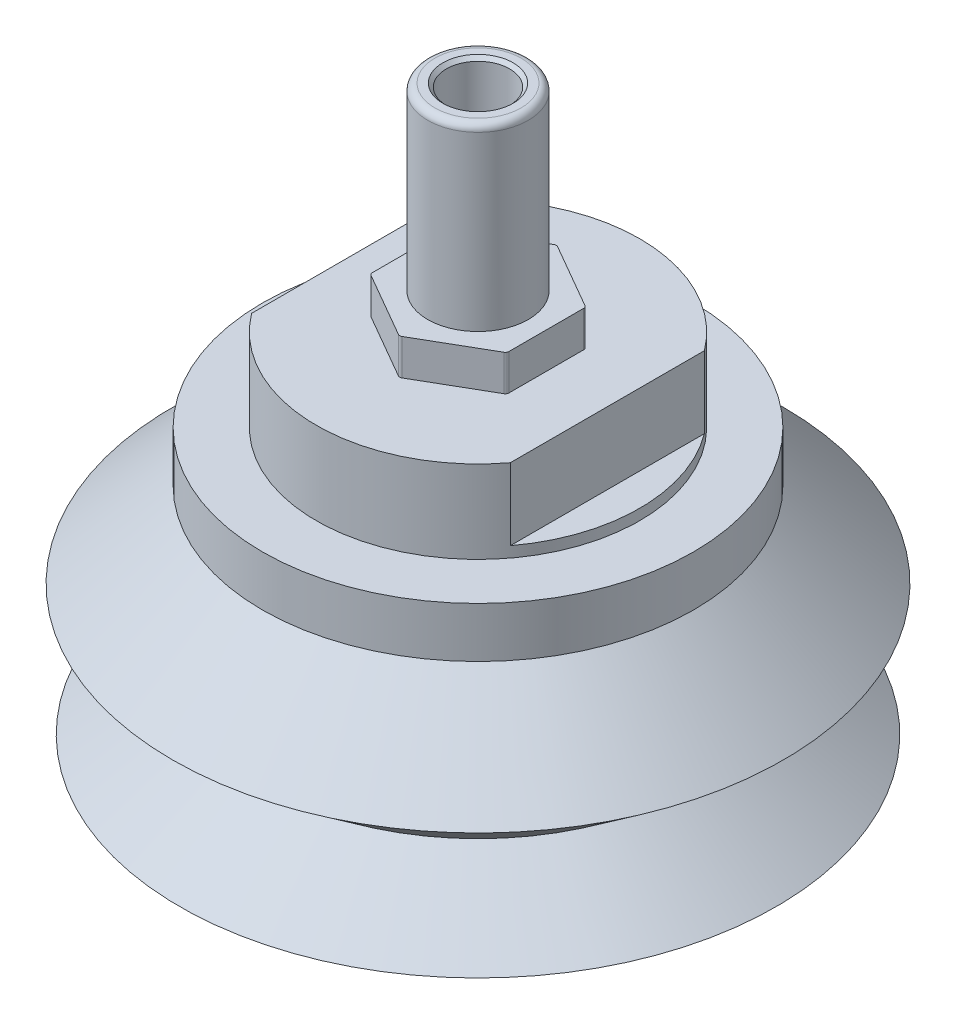
ISO-10303-21;
HEADER;
FILE_DESCRIPTION(('STEP AP214'),'2;1');
FILE_NAME('part.step','',(''),(''),'','','');
FILE_SCHEMA(('AUTOMOTIVE_DESIGN { 1 0 10303 214 1 1 1 1 }'));
ENDSEC;
DATA;
#1=APPLICATION_CONTEXT('core data for automotive mechanical design processes');
#2=APPLICATION_PROTOCOL_DEFINITION('international standard','automotive_design',2000,#1);
#3=PRODUCT_CONTEXT('',#1,'mechanical');
#4=PRODUCT('Part','Part','',(#3));
#5=PRODUCT_RELATED_PRODUCT_CATEGORY('part','',(#4));
#6=PRODUCT_DEFINITION_FORMATION('','',#4);
#7=PRODUCT_DEFINITION_CONTEXT('part definition',#1,'design');
#8=PRODUCT_DEFINITION('design','',#6,#7);
#9=PRODUCT_DEFINITION_SHAPE('','',#8);
#10=(LENGTH_UNIT() NAMED_UNIT(*) SI_UNIT(.MILLI.,.METRE.));
#11=(NAMED_UNIT(*) PLANE_ANGLE_UNIT() SI_UNIT($,.RADIAN.));
#12=(NAMED_UNIT(*) SI_UNIT($,.STERADIAN.) SOLID_ANGLE_UNIT());
#13=UNCERTAINTY_MEASURE_WITH_UNIT(LENGTH_MEASURE(1.E-05),#10,'distance_accuracy_value','');
#14=(GEOMETRIC_REPRESENTATION_CONTEXT(3) GLOBAL_UNCERTAINTY_ASSIGNED_CONTEXT((#13)) GLOBAL_UNIT_ASSIGNED_CONTEXT((#10,
#11,#12)) REPRESENTATION_CONTEXT('',''));
#15=CARTESIAN_POINT('',(0.,0.,0.));
#16=DIRECTION('',(0.,0.,1.));
#17=DIRECTION('',(1.,0.,0.));
#18=AXIS2_PLACEMENT_3D('',#15,#16,#17);
#19=CARTESIAN_POINT('',(-22.5,48.5,0.));
#20=DIRECTION('',(0.,-1.,0.));
#21=DIRECTION('',(0.,0.,-1.));
#22=AXIS2_PLACEMENT_3D('',#19,#20,#21);
#23=PLANE('',#22);
#24=CARTESIAN_POINT('',(0.,48.5,0.));
#25=DIRECTION('',(0.,-1.,0.));
#26=DIRECTION('',(0.,0.,-1.));
#27=AXIS2_PLACEMENT_3D('',#24,#25,#26);
#28=CIRCLE('',#27,22.5);
#29=CARTESIAN_POINT('',(18.,48.5,13.5));
#30=VERTEX_POINT('',#29);
#31=CARTESIAN_POINT('',(-18.,48.5,13.5));
#32=VERTEX_POINT('',#31);
#33=EDGE_CURVE('E176',#30,#32,#28,.T.);
#34=ORIENTED_EDGE('',*,*,#33,.F.);
#35=DIRECTION('',(0.,0.,1.));
#36=VECTOR('',#35,1.);
#37=CARTESIAN_POINT('',(18.,48.5,-32.3883713654961));
#38=LINE('',#37,#36);
#39=CARTESIAN_POINT('',(18.,48.5,-13.5));
#40=VERTEX_POINT('',#39);
#41=EDGE_CURVE('E179',#40,#30,#38,.T.);
#42=ORIENTED_EDGE('',*,*,#41,.F.);
#43=CARTESIAN_POINT('',(-18.,48.5,-13.5));
#44=VERTEX_POINT('',#43);
#45=EDGE_CURVE('E178',#44,#40,#28,.T.);
#46=ORIENTED_EDGE('',*,*,#45,.F.);
#47=DIRECTION('',(0.,0.,-1.));
#48=VECTOR('',#47,1.);
#49=CARTESIAN_POINT('',(-18.,48.5,-32.3883713654961));
#50=LINE('',#49,#48);
#51=EDGE_CURVE('E163',#32,#44,#50,.T.);
#52=ORIENTED_EDGE('',*,*,#51,.F.);
#53=EDGE_LOOP('',(#34,#42,#46,#52));
#54=FACE_BOUND('',#53,.T.);
#55=DIRECTION('',(-0.866025403784439,0.,-0.5));
#56=VECTOR('',#55,1.);
#57=CARTESIAN_POINT('',(9.5,48.5,-5.48482755730145));
#58=LINE('',#57,#56);
#59=CARTESIAN_POINT('',(9.25,48.5,-5.62916512459885));
#60=VERTEX_POINT('',#59);
#61=CARTESIAN_POINT('',(0.249999999999997,48.5,-10.8253175473055));
#62=VERTEX_POINT('',#61);
#63=EDGE_CURVE('E295',#60,#62,#58,.T.);
#64=ORIENTED_EDGE('',*,*,#63,.F.);
#65=CARTESIAN_POINT('',(9.,48.5,-5.19615242270663));
#66=DIRECTION('',(0.,-1.,0.));
#67=DIRECTION('',(0.,0.,-1.));
#68=AXIS2_PLACEMENT_3D('',#65,#66,#67);
#69=CIRCLE('',#68,0.5);
#70=CARTESIAN_POINT('',(9.5,48.5,-5.19615242270663));
#71=VERTEX_POINT('',#70);
#72=EDGE_CURVE('E282',#60,#71,#69,.T.);
#73=ORIENTED_EDGE('',*,*,#72,.T.);
#74=DIRECTION('',(0.,0.,-1.));
#75=VECTOR('',#74,1.);
#76=CARTESIAN_POINT('',(9.5,48.5,5.48482755730145));
#77=LINE('',#76,#75);
#78=CARTESIAN_POINT('',(9.5,48.5,5.19615242270663));
#79=VERTEX_POINT('',#78);
#80=EDGE_CURVE('E334',#79,#71,#77,.T.);
#81=ORIENTED_EDGE('',*,*,#80,.F.);
#82=CARTESIAN_POINT('',(9.,48.5,5.19615242270663));
#83=DIRECTION('',(0.,-1.,0.));
#84=DIRECTION('',(0.,0.,-1.));
#85=AXIS2_PLACEMENT_3D('',#82,#83,#84);
#86=CIRCLE('',#85,0.5);
#87=CARTESIAN_POINT('',(9.25,48.5,5.62916512459886));
#88=VERTEX_POINT('',#87);
#89=EDGE_CURVE('E280',#79,#88,#86,.T.);
#90=ORIENTED_EDGE('',*,*,#89,.T.);
#91=DIRECTION('',(0.866025403784439,0.,-0.5));
#92=VECTOR('',#91,1.);
#93=CARTESIAN_POINT('',(0.,48.5,10.9696551146029));
#94=LINE('',#93,#92);
#95=CARTESIAN_POINT('',(0.250000000000004,48.5,10.8253175473055));
#96=VERTEX_POINT('',#95);
#97=EDGE_CURVE('E331',#96,#88,#94,.T.);
#98=ORIENTED_EDGE('',*,*,#97,.F.);
#99=CARTESIAN_POINT('',(0.,48.5,10.3923048454133));
#100=DIRECTION('',(0.,-1.,0.));
#101=DIRECTION('',(0.,0.,-1.));
#102=AXIS2_PLACEMENT_3D('',#99,#100,#101);
#103=CIRCLE('',#102,0.5);
#104=CARTESIAN_POINT('',(-0.249999999999999,48.5,10.8253175473055));
#105=VERTEX_POINT('',#104);
#106=EDGE_CURVE('E278',#96,#105,#103,.T.);
#107=ORIENTED_EDGE('',*,*,#106,.T.);
#108=DIRECTION('',(0.866025403784439,0.,0.5));
#109=VECTOR('',#108,1.);
#110=CARTESIAN_POINT('',(-9.5,48.5,5.48482755730145));
#111=LINE('',#110,#109);
#112=CARTESIAN_POINT('',(-9.25,48.5,5.62916512459885));
#113=VERTEX_POINT('',#112);
#114=EDGE_CURVE('E328',#113,#105,#111,.T.);
#115=ORIENTED_EDGE('',*,*,#114,.F.);
#116=CARTESIAN_POINT('',(-9.,48.5,5.19615242270663));
#117=DIRECTION('',(0.,-1.,0.));
#118=DIRECTION('',(0.,0.,-1.));
#119=AXIS2_PLACEMENT_3D('',#116,#117,#118);
#120=CIRCLE('',#119,0.5);
#121=CARTESIAN_POINT('',(-9.5,48.5,5.19615242270663));
#122=VERTEX_POINT('',#121);
#123=EDGE_CURVE('E11',#113,#122,#120,.T.);
#124=ORIENTED_EDGE('',*,*,#123,.T.);
#125=DIRECTION('',(0.,0.,1.));
#126=VECTOR('',#125,1.);
#127=CARTESIAN_POINT('',(-9.5,48.5,-5.48482755730145));
#128=LINE('',#127,#126);
#129=CARTESIAN_POINT('',(-9.5,48.5,-5.19615242270664));
#130=VERTEX_POINT('',#129);
#131=EDGE_CURVE('E289',#130,#122,#128,.T.);
#132=ORIENTED_EDGE('',*,*,#131,.F.);
#133=CARTESIAN_POINT('',(-9.,48.5,-5.19615242270664));
#134=DIRECTION('',(0.,-1.,0.));
#135=DIRECTION('',(0.,0.,-1.));
#136=AXIS2_PLACEMENT_3D('',#133,#134,#135);
#137=CIRCLE('',#136,0.5);
#138=CARTESIAN_POINT('',(-9.25,48.5,-5.62916512459886));
#139=VERTEX_POINT('',#138);
#140=EDGE_CURVE('E55',#130,#139,#137,.T.);
#141=ORIENTED_EDGE('',*,*,#140,.T.);
#142=DIRECTION('',(-0.866025403784439,0.,0.5));
#143=VECTOR('',#142,1.);
#144=CARTESIAN_POINT('',(0.,48.5,-10.9696551146029));
#145=LINE('',#144,#143);
#146=CARTESIAN_POINT('',(-0.250000000000002,48.5,-10.8253175473055));
#147=VERTEX_POINT('',#146);
#148=EDGE_CURVE('E288',#147,#139,#145,.T.);
#149=ORIENTED_EDGE('',*,*,#148,.F.);
#150=CARTESIAN_POINT('',(0.,48.5,-10.3923048454133));
#151=DIRECTION('',(0.,-1.,0.));
#152=DIRECTION('',(0.,0.,-1.));
#153=AXIS2_PLACEMENT_3D('',#150,#151,#152);
#154=CIRCLE('',#153,0.5);
#155=EDGE_CURVE('E284',#147,#62,#154,.T.);
#156=ORIENTED_EDGE('',*,*,#155,.T.);
#157=EDGE_LOOP('',(#64,#73,#81,#90,#98,#107,#115,#124,#132,#141,#149,#156));
#158=FACE_BOUND('',#157,.T.);
#159=ADVANCED_FACE('F47',(#54,#158),#23,.F.);
#160=CARTESIAN_POINT('',(-30.,37.,0.));
#161=DIRECTION('',(0.,-1.,0.));
#162=DIRECTION('',(0.,0.,-1.));
#163=AXIS2_PLACEMENT_3D('',#160,#161,#162);
#164=PLANE('',#163);
#165=CARTESIAN_POINT('',(0.,37.,0.));
#166=DIRECTION('',(0.,-1.,0.));
#167=DIRECTION('',(0.,0.,-1.));
#168=AXIS2_PLACEMENT_3D('',#165,#166,#167);
#169=CIRCLE('',#168,30.);
#170=CARTESIAN_POINT('',(0.,37.,-30.));
#171=VERTEX_POINT('',#170);
#172=EDGE_CURVE('E216',#171,#171,#169,.T.);
#173=ORIENTED_EDGE('',*,*,#172,.F.);
#174=EDGE_LOOP('',(#173));
#175=FACE_BOUND('',#174,.T.);
#176=CARTESIAN_POINT('',(0.,37.,0.));
#177=DIRECTION('',(0.,-1.,0.));
#178=DIRECTION('',(0.,0.,-1.));
#179=AXIS2_PLACEMENT_3D('',#176,#177,#178);
#180=CIRCLE('',#179,22.5);
#181=CARTESIAN_POINT('',(0.,37.,-22.5));
#182=VERTEX_POINT('',#181);
#183=EDGE_CURVE('E192',#182,#182,#180,.T.);
#184=ORIENTED_EDGE('',*,*,#183,.T.);
#185=EDGE_LOOP('',(#184));
#186=FACE_BOUND('',#185,.T.);
#187=ADVANCED_FACE('F375',(#175,#186),#164,.F.);
#188=CARTESIAN_POINT('',(0.,0.,0.));
#189=DIRECTION('',(0.,-1.,0.));
#190=DIRECTION('',(0.,0.,-1.));
#191=AXIS2_PLACEMENT_3D('',#188,#189,#190);
#192=CYLINDRICAL_SURFACE('',#191,30.);
#193=CARTESIAN_POINT('',(0.,30.,0.));
#194=DIRECTION('',(0.,-1.,0.));
#195=DIRECTION('',(0.,0.,-1.));
#196=AXIS2_PLACEMENT_3D('',#193,#194,#195);
#197=CIRCLE('',#196,30.);
#198=CARTESIAN_POINT('',(0.,30.,-30.));
#199=VERTEX_POINT('',#198);
#200=EDGE_CURVE('E213',#199,#199,#197,.T.);
#201=ORIENTED_EDGE('',*,*,#200,.F.);
#202=EDGE_LOOP('',(#201));
#203=FACE_BOUND('',#202,.T.);
#204=ORIENTED_EDGE('',*,*,#172,.T.);
#205=EDGE_LOOP('',(#204));
#206=FACE_BOUND('',#205,.T.);
#207=ADVANCED_FACE('F382',(#203,#206),#192,.T.);
#208=CARTESIAN_POINT('',(0.,30.,0.));
#209=DIRECTION('',(0.,-1.,0.));
#210=DIRECTION('',(0.,0.,-1.));
#211=AXIS2_PLACEMENT_3D('',#208,#209,#210);
#212=CONICAL_SURFACE('',#211,30.,0.813287015445604);
#213=CARTESIAN_POINT('',(0.,18.1784753159558,0.));
#214=DIRECTION('',(0.,-1.,0.));
#215=DIRECTION('',(0.,0.,-1.));
#216=AXIS2_PLACEMENT_3D('',#213,#214,#215);
#217=CIRCLE('',#216,42.5);
#218=CARTESIAN_POINT('',(0.,18.1784753159558,-42.5));
#219=VERTEX_POINT('',#218);
#220=EDGE_CURVE('E210',#219,#219,#217,.T.);
#221=ORIENTED_EDGE('',*,*,#220,.F.);
#222=EDGE_LOOP('',(#221));
#223=FACE_BOUND('',#222,.T.);
#224=ORIENTED_EDGE('',*,*,#200,.T.);
#225=EDGE_LOOP('',(#224));
#226=FACE_BOUND('',#225,.T.);
#227=ADVANCED_FACE('F632',(#223,#226),#212,.T.);
#228=CARTESIAN_POINT('',(0.,18.1784753159558,0.));
#229=DIRECTION('',(0.,1.,0.));
#230=DIRECTION('',(0.,0.,1.));
#231=AXIS2_PLACEMENT_3D('',#228,#229,#230);
#232=CONICAL_SURFACE('',#231,42.5,0.919573942202918);
#233=CARTESIAN_POINT('',(0.,8.65178771721958,0.));
#234=DIRECTION('',(0.,-1.,0.));
#235=DIRECTION('',(0.,0.,-1.));
#236=AXIS2_PLACEMENT_3D('',#233,#234,#235);
#237=CIRCLE('',#236,30.);
#238=CARTESIAN_POINT('',(0.,8.65178771721958,-30.));
#239=VERTEX_POINT('',#238);
#240=EDGE_CURVE('E207',#239,#239,#237,.T.);
#241=ORIENTED_EDGE('',*,*,#240,.F.);
#242=EDGE_LOOP('',(#241));
#243=FACE_BOUND('',#242,.T.);
#244=ORIENTED_EDGE('',*,*,#220,.T.);
#245=EDGE_LOOP('',(#244));
#246=FACE_BOUND('',#245,.T.);
#247=ADVANCED_FACE('F623',(#243,#246),#232,.T.);
#248=CARTESIAN_POINT('',(0.,8.65178771721958,0.));
#249=DIRECTION('',(0.,-1.,0.));
#250=DIRECTION('',(0.,0.,-1.));
#251=AXIS2_PLACEMENT_3D('',#248,#249,#250);
#252=CONICAL_SURFACE('',#251,30.,0.925806089394895);
#253=CARTESIAN_POINT('',(0.,0.,0.));
#254=DIRECTION('',(0.,-1.,0.));
#255=DIRECTION('',(0.,0.,-1.));
#256=AXIS2_PLACEMENT_3D('',#253,#254,#255);
#257=CIRCLE('',#256,41.5);
#258=CARTESIAN_POINT('',(0.,0.,-41.5));
#259=VERTEX_POINT('',#258);
#260=EDGE_CURVE('E204',#259,#259,#257,.T.);
#261=ORIENTED_EDGE('',*,*,#260,.F.);
#262=EDGE_LOOP('',(#261));
#263=FACE_BOUND('',#262,.T.);
#264=ORIENTED_EDGE('',*,*,#240,.T.);
#265=EDGE_LOOP('',(#264));
#266=FACE_BOUND('',#265,.T.);
#267=ADVANCED_FACE('F614',(#263,#266),#252,.T.);
#268=CARTESIAN_POINT('',(-40.5,0.,0.));
#269=DIRECTION('',(0.,1.,0.));
#270=DIRECTION('',(0.,0.,1.));
#271=AXIS2_PLACEMENT_3D('',#268,#269,#270);
#272=PLANE('',#271);
#273=CARTESIAN_POINT('',(0.,0.,0.));
#274=DIRECTION('',(0.,-1.,0.));
#275=DIRECTION('',(0.,0.,-1.));
#276=AXIS2_PLACEMENT_3D('',#273,#274,#275);
#277=CIRCLE('',#276,40.5);
#278=CARTESIAN_POINT('',(0.,0.,-40.5));
#279=VERTEX_POINT('',#278);
#280=EDGE_CURVE('E201',#279,#279,#277,.T.);
#281=ORIENTED_EDGE('',*,*,#280,.F.);
#282=EDGE_LOOP('',(#281));
#283=FACE_BOUND('',#282,.T.);
#284=ORIENTED_EDGE('',*,*,#260,.T.);
#285=EDGE_LOOP('',(#284));
#286=FACE_BOUND('',#285,.T.);
#287=ADVANCED_FACE('F605',(#283,#286),#272,.F.);
#288=CARTESIAN_POINT('',(0.,0.,0.));
#289=DIRECTION('',(0.,-1.,0.));
#290=DIRECTION('',(0.,0.,-1.));
#291=AXIS2_PLACEMENT_3D('',#288,#289,#290);
#292=CONICAL_SURFACE('',#291,40.5,0.925806089394895);
#293=CARTESIAN_POINT('',(0.,8.65178771721958,0.));
#294=DIRECTION('',(0.,-1.,0.));
#295=DIRECTION('',(0.,0.,-1.));
#296=AXIS2_PLACEMENT_3D('',#293,#294,#295);
#297=CIRCLE('',#296,29.);
#298=CARTESIAN_POINT('',(0.,8.65178771721958,-29.));
#299=VERTEX_POINT('',#298);
#300=EDGE_CURVE('E198',#299,#299,#297,.T.);
#301=ORIENTED_EDGE('',*,*,#300,.F.);
#302=EDGE_LOOP('',(#301));
#303=FACE_BOUND('',#302,.T.);
#304=ORIENTED_EDGE('',*,*,#280,.T.);
#305=EDGE_LOOP('',(#304));
#306=FACE_BOUND('',#305,.T.);
#307=ADVANCED_FACE('F596',(#303,#306),#292,.F.);
#308=CARTESIAN_POINT('',(0.,8.65178771721958,0.));
#309=DIRECTION('',(0.,1.,0.));
#310=DIRECTION('',(0.,0.,1.));
#311=AXIS2_PLACEMENT_3D('',#308,#309,#310);
#312=CONICAL_SURFACE('',#311,29.,0.919573942202918);
#313=CARTESIAN_POINT('',(0.,18.1784753159558,0.));
#314=DIRECTION('',(0.,-1.,0.));
#315=DIRECTION('',(0.,0.,-1.));
#316=AXIS2_PLACEMENT_3D('',#313,#314,#315);
#317=CIRCLE('',#316,41.5);
#318=CARTESIAN_POINT('',(0.,18.1784753159558,-41.5));
#319=VERTEX_POINT('',#318);
#320=EDGE_CURVE('E190',#319,#319,#317,.T.);
#321=ORIENTED_EDGE('',*,*,#320,.F.);
#322=EDGE_LOOP('',(#321));
#323=FACE_BOUND('',#322,.T.);
#324=ORIENTED_EDGE('',*,*,#300,.T.);
#325=EDGE_LOOP('',(#324));
#326=FACE_BOUND('',#325,.T.);
#327=ADVANCED_FACE('F587',(#323,#326),#312,.F.);
#328=CARTESIAN_POINT('',(0.,18.1784753159558,0.));
#329=DIRECTION('',(0.,-1.,0.));
#330=DIRECTION('',(0.,0.,-1.));
#331=AXIS2_PLACEMENT_3D('',#328,#329,#330);
#332=CONICAL_SURFACE('',#331,41.5,0.813287015445604);
#333=CARTESIAN_POINT('',(0.,30.,0.));
#334=DIRECTION('',(0.,-1.,0.));
#335=DIRECTION('',(0.,0.,-1.));
#336=AXIS2_PLACEMENT_3D('',#333,#334,#335);
#337=CIRCLE('',#336,29.);
#338=CARTESIAN_POINT('',(0.,30.,-29.));
#339=VERTEX_POINT('',#338);
#340=EDGE_CURVE('E187',#339,#339,#337,.T.);
#341=ORIENTED_EDGE('',*,*,#340,.F.);
#342=EDGE_LOOP('',(#341));
#343=FACE_BOUND('',#342,.T.);
#344=ORIENTED_EDGE('',*,*,#320,.T.);
#345=EDGE_LOOP('',(#344));
#346=FACE_BOUND('',#345,.T.);
#347=ADVANCED_FACE('F371',(#343,#346),#332,.F.);
#348=CARTESIAN_POINT('',(-29.,30.,0.));
#349=DIRECTION('',(0.,1.,0.));
#350=DIRECTION('',(0.,0.,1.));
#351=AXIS2_PLACEMENT_3D('',#348,#349,#350);
#352=PLANE('',#351);
#353=CARTESIAN_POINT('',(0.,30.,0.));
#354=DIRECTION('',(0.,1.,0.));
#355=DIRECTION('',(0.,0.,1.));
#356=AXIS2_PLACEMENT_3D('',#353,#354,#355);
#357=CIRCLE('',#356,4.39999999999999);
#358=CARTESIAN_POINT('',(0.,30.,4.39999999999999));
#359=VERTEX_POINT('',#358);
#360=EDGE_CURVE('E220',#359,#359,#357,.T.);
#361=ORIENTED_EDGE('',*,*,#360,.T.);
#362=EDGE_LOOP('',(#361));
#363=FACE_BOUND('',#362,.T.);
#364=ORIENTED_EDGE('',*,*,#340,.T.);
#365=EDGE_LOOP('',(#364));
#366=FACE_BOUND('',#365,.T.);
#367=ADVANCED_FACE('F361',(#363,#366),#352,.F.);
#368=CARTESIAN_POINT('',(-7.,78.5,0.));
#369=DIRECTION('',(0.,-1.,0.));
#370=DIRECTION('',(0.,0.,-1.));
#371=AXIS2_PLACEMENT_3D('',#368,#369,#370);
#372=PLANE('',#371);
#373=CARTESIAN_POINT('',(0.,78.5,0.));
#374=DIRECTION('',(0.,-1.,0.));
#375=DIRECTION('',(0.,0.,-1.));
#376=AXIS2_PLACEMENT_3D('',#373,#374,#375);
#377=CIRCLE('',#376,6.);
#378=CARTESIAN_POINT('',(0.,78.5,-6.));
#379=VERTEX_POINT('',#378);
#380=EDGE_CURVE('E226',#379,#379,#377,.F.);
#381=ORIENTED_EDGE('',*,*,#380,.T.);
#382=EDGE_LOOP('',(#381));
#383=FACE_BOUND('',#382,.T.);
#384=CARTESIAN_POINT('',(0.,78.5,0.));
#385=DIRECTION('',(0.,1.,0.));
#386=DIRECTION('',(0.,0.,1.));
#387=AXIS2_PLACEMENT_3D('',#384,#385,#386);
#388=CIRCLE('',#387,4.889);
#389=CARTESIAN_POINT('',(0.,78.5,4.889));
#390=VERTEX_POINT('',#389);
#391=EDGE_CURVE('E341',#390,#390,#388,.T.);
#392=ORIENTED_EDGE('',*,*,#391,.F.);
#393=EDGE_LOOP('',(#392));
#394=FACE_BOUND('',#393,.T.);
#395=ADVANCED_FACE('F358',(#383,#394),#372,.F.);
#396=CARTESIAN_POINT('',(0.,0.,0.));
#397=DIRECTION('',(0.,-1.,0.));
#398=DIRECTION('',(0.,0.,-1.));
#399=AXIS2_PLACEMENT_3D('',#396,#397,#398);
#400=CYLINDRICAL_SURFACE('',#399,7.);
#401=CARTESIAN_POINT('',(0.,53.5,0.));
#402=DIRECTION('',(0.,1.,0.));
#403=DIRECTION('',(0.,0.,1.));
#404=AXIS2_PLACEMENT_3D('',#401,#402,#403);
#405=CIRCLE('',#404,7.);
#406=CARTESIAN_POINT('',(0.,53.5,7.));
#407=VERTEX_POINT('',#406);
#408=EDGE_CURVE('E324',#407,#407,#405,.T.);
#409=ORIENTED_EDGE('',*,*,#408,.T.);
#410=EDGE_LOOP('',(#409));
#411=FACE_BOUND('',#410,.T.);
#412=CARTESIAN_POINT('',(0.,77.5,0.));
#413=DIRECTION('',(0.,-1.,0.));
#414=DIRECTION('',(0.,0.,-1.));
#415=AXIS2_PLACEMENT_3D('',#412,#413,#414);
#416=CIRCLE('',#415,7.);
#417=CARTESIAN_POINT('',(0.,77.5,-7.));
#418=VERTEX_POINT('',#417);
#419=EDGE_CURVE('E219',#418,#418,#416,.T.);
#420=ORIENTED_EDGE('',*,*,#419,.T.);
#421=EDGE_LOOP('',(#420));
#422=FACE_BOUND('',#421,.T.);
#423=ADVANCED_FACE('F360',(#411,#422),#400,.T.);
#424=CARTESIAN_POINT('',(0.,0.,0.));
#425=DIRECTION('',(0.,-1.,0.));
#426=DIRECTION('',(0.,0.,-1.));
#427=AXIS2_PLACEMENT_3D('',#424,#425,#426);
#428=CYLINDRICAL_SURFACE('',#427,22.5);
#429=ORIENTED_EDGE('',*,*,#45,.T.);
#430=DIRECTION('',(0.,-1.,0.));
#431=VECTOR('',#430,1.);
#432=CARTESIAN_POINT('',(18.,0.,-13.5));
#433=LINE('',#432,#431);
#434=CARTESIAN_POINT('',(18.,38.5,-13.5));
#435=VERTEX_POINT('',#434);
#436=EDGE_CURVE('E234',#40,#435,#433,.T.);
#437=ORIENTED_EDGE('',*,*,#436,.T.);
#438=CARTESIAN_POINT('',(0.,38.5,0.));
#439=DIRECTION('',(0.,1.,0.));
#440=DIRECTION('',(0.,0.,1.));
#441=AXIS2_PLACEMENT_3D('',#438,#439,#440);
#442=CIRCLE('',#441,22.5);
#443=CARTESIAN_POINT('',(18.,38.5,13.5));
#444=VERTEX_POINT('',#443);
#445=EDGE_CURVE('E169',#444,#435,#442,.T.);
#446=ORIENTED_EDGE('',*,*,#445,.F.);
#447=DIRECTION('',(0.,-1.,0.));
#448=VECTOR('',#447,1.);
#449=CARTESIAN_POINT('',(18.,0.,13.5));
#450=LINE('',#449,#448);
#451=EDGE_CURVE('E186',#444,#30,#450,.F.);
#452=ORIENTED_EDGE('',*,*,#451,.T.);
#453=ORIENTED_EDGE('',*,*,#33,.T.);
#454=DIRECTION('',(0.,-1.,0.));
#455=VECTOR('',#454,1.);
#456=CARTESIAN_POINT('',(-18.,0.,13.5));
#457=LINE('',#456,#455);
#458=CARTESIAN_POINT('',(-18.,38.5,13.5));
#459=VERTEX_POINT('',#458);
#460=EDGE_CURVE('E159',#32,#459,#457,.T.);
#461=ORIENTED_EDGE('',*,*,#460,.T.);
#462=CARTESIAN_POINT('',(0.,38.5,0.));
#463=DIRECTION('',(0.,-1.,0.));
#464=DIRECTION('',(0.,0.,-1.));
#465=AXIS2_PLACEMENT_3D('',#462,#463,#464);
#466=CIRCLE('',#465,22.5);
#467=CARTESIAN_POINT('',(-18.,38.5,-13.5));
#468=VERTEX_POINT('',#467);
#469=EDGE_CURVE('E229',#459,#468,#466,.T.);
#470=ORIENTED_EDGE('',*,*,#469,.T.);
#471=DIRECTION('',(0.,-1.,0.));
#472=VECTOR('',#471,1.);
#473=CARTESIAN_POINT('',(-18.,0.,-13.5));
#474=LINE('',#473,#472);
#475=EDGE_CURVE('E170',#468,#44,#474,.F.);
#476=ORIENTED_EDGE('',*,*,#475,.T.);
#477=EDGE_LOOP('',(#429,#437,#446,#452,#453,#461,#470,#476));
#478=FACE_BOUND('',#477,.T.);
#479=ORIENTED_EDGE('',*,*,#183,.F.);
#480=EDGE_LOOP('',(#479));
#481=FACE_BOUND('',#480,.T.);
#482=ADVANCED_FACE('F182',(#478,#481),#428,.T.);
#483=CARTESIAN_POINT('',(0.,78.5,0.));
#484=DIRECTION('',(0.,1.,0.));
#485=DIRECTION('',(0.,0.,1.));
#486=AXIS2_PLACEMENT_3D('',#483,#484,#485);
#487=CYLINDRICAL_SURFACE('',#486,4.39999999999999);
#488=CARTESIAN_POINT('',(0.,78.011,0.));
#489=DIRECTION('',(0.,1.,0.));
#490=DIRECTION('',(0.,0.,1.));
#491=AXIS2_PLACEMENT_3D('',#488,#489,#490);
#492=CIRCLE('',#491,4.4);
#493=CARTESIAN_POINT('',(0.,78.011,4.4));
#494=VERTEX_POINT('',#493);
#495=EDGE_CURVE('E223',#494,#494,#492,.T.);
#496=ORIENTED_EDGE('',*,*,#495,.T.);
#497=EDGE_LOOP('',(#496));
#498=FACE_BOUND('',#497,.T.);
#499=ORIENTED_EDGE('',*,*,#360,.F.);
#500=EDGE_LOOP('',(#499));
#501=FACE_BOUND('',#500,.T.);
#502=ADVANCED_FACE('F348',(#498,#501),#487,.F.);
#503=CARTESIAN_POINT('',(0.,78.5,0.));
#504=DIRECTION('',(0.,1.,0.));
#505=DIRECTION('',(0.,0.,1.));
#506=AXIS2_PLACEMENT_3D('',#503,#504,#505);
#507=CONICAL_SURFACE('',#506,4.889,0.785398163397448);
#508=ORIENTED_EDGE('',*,*,#495,.F.);
#509=EDGE_LOOP('',(#508));
#510=FACE_BOUND('',#509,.T.);
#511=ORIENTED_EDGE('',*,*,#391,.T.);
#512=EDGE_LOOP('',(#511));
#513=FACE_BOUND('',#512,.T.);
#514=ADVANCED_FACE('F351',(#510,#513),#507,.F.);
#515=CARTESIAN_POINT('',(0.,77.5,0.));
#516=DIRECTION('',(0.,-1.,0.));
#517=DIRECTION('',(0.,0.,-1.));
#518=AXIS2_PLACEMENT_3D('',#515,#516,#517);
#519=TOROIDAL_SURFACE('',#518,6.,1.);
#520=ORIENTED_EDGE('',*,*,#380,.F.);
#521=EDGE_LOOP('',(#520));
#522=FACE_BOUND('',#521,.T.);
#523=ORIENTED_EDGE('',*,*,#419,.F.);
#524=EDGE_LOOP('',(#523));
#525=FACE_BOUND('',#524,.T.);
#526=ADVANCED_FACE('F354',(#522,#525),#519,.T.);
#527=CARTESIAN_POINT('',(-18.,38.5,-32.3883713654961));
#528=DIRECTION('',(1.,0.,0.));
#529=DIRECTION('',(0.,0.,-1.));
#530=AXIS2_PLACEMENT_3D('',#527,#528,#529);
#531=PLANE('',#530);
#532=ORIENTED_EDGE('',*,*,#51,.T.);
#533=ORIENTED_EDGE('',*,*,#475,.F.);
#534=DIRECTION('',(0.,0.,-1.));
#535=VECTOR('',#534,1.);
#536=CARTESIAN_POINT('',(-18.,38.5,-32.3883713654961));
#537=LINE('',#536,#535);
#538=EDGE_CURVE('E165',#459,#468,#537,.T.);
#539=ORIENTED_EDGE('',*,*,#538,.F.);
#540=ORIENTED_EDGE('',*,*,#460,.F.);
#541=EDGE_LOOP('',(#532,#533,#539,#540));
#542=FACE_BOUND('',#541,.T.);
#543=ADVANCED_FACE('F161',(#542),#531,.F.);
#544=CARTESIAN_POINT('',(0.,38.5,0.));
#545=DIRECTION('',(0.,-1.,0.));
#546=DIRECTION('',(0.,0.,-1.));
#547=AXIS2_PLACEMENT_3D('',#544,#545,#546);
#548=PLANE('',#547);
#549=ORIENTED_EDGE('',*,*,#538,.T.);
#550=ORIENTED_EDGE('',*,*,#469,.F.);
#551=EDGE_LOOP('',(#549,#550));
#552=FACE_BOUND('',#551,.T.);
#553=ADVANCED_FACE('F390',(#552),#548,.F.);
#554=CARTESIAN_POINT('',(18.,38.5,-32.3883713654961));
#555=DIRECTION('',(-1.,0.,0.));
#556=DIRECTION('',(0.,0.,1.));
#557=AXIS2_PLACEMENT_3D('',#554,#555,#556);
#558=PLANE('',#557);
#559=ORIENTED_EDGE('',*,*,#41,.T.);
#560=ORIENTED_EDGE('',*,*,#451,.F.);
#561=DIRECTION('',(0.,0.,1.));
#562=VECTOR('',#561,1.);
#563=CARTESIAN_POINT('',(18.,38.5,-32.3883713654961));
#564=LINE('',#563,#562);
#565=EDGE_CURVE('E339',#435,#444,#564,.T.);
#566=ORIENTED_EDGE('',*,*,#565,.F.);
#567=ORIENTED_EDGE('',*,*,#436,.F.);
#568=EDGE_LOOP('',(#559,#560,#566,#567));
#569=FACE_BOUND('',#568,.T.);
#570=ADVANCED_FACE('F393',(#569),#558,.F.);
#571=CARTESIAN_POINT('',(0.,38.5,0.));
#572=DIRECTION('',(0.,1.,0.));
#573=DIRECTION('',(0.,0.,1.));
#574=AXIS2_PLACEMENT_3D('',#571,#572,#573);
#575=PLANE('',#574);
#576=ORIENTED_EDGE('',*,*,#445,.T.);
#577=ORIENTED_EDGE('',*,*,#565,.T.);
#578=EDGE_LOOP('',(#576,#577));
#579=FACE_BOUND('',#578,.T.);
#580=ADVANCED_FACE('F399',(#579),#575,.T.);
#581=CARTESIAN_POINT('',(0.,53.5,0.));
#582=DIRECTION('',(0.,1.,0.));
#583=DIRECTION('',(0.,0.,1.));
#584=AXIS2_PLACEMENT_3D('',#581,#582,#583);
#585=PLANE('',#584);
#586=DIRECTION('',(0.866025403784439,0.,0.5));
#587=VECTOR('',#586,1.);
#588=CARTESIAN_POINT('',(-9.5,53.5,5.48482755730145));
#589=LINE('',#588,#587);
#590=CARTESIAN_POINT('',(-9.25,53.5,5.62916512459885));
#591=VERTEX_POINT('',#590);
#592=CARTESIAN_POINT('',(-0.249999999999999,53.5,10.8253175473055));
#593=VERTEX_POINT('',#592);
#594=EDGE_CURVE('E311',#591,#593,#589,.T.);
#595=ORIENTED_EDGE('',*,*,#594,.T.);
#596=CARTESIAN_POINT('',(0.,53.5,10.3923048454133));
#597=DIRECTION('',(0.,1.,0.));
#598=DIRECTION('',(0.,0.,1.));
#599=AXIS2_PLACEMENT_3D('',#596,#597,#598);
#600=CIRCLE('',#599,0.5);
#601=CARTESIAN_POINT('',(0.250000000000004,53.5,10.8253175473055));
#602=VERTEX_POINT('',#601);
#603=EDGE_CURVE('E257',#593,#602,#600,.T.);
#604=ORIENTED_EDGE('',*,*,#603,.T.);
#605=DIRECTION('',(0.866025403784439,0.,-0.5));
#606=VECTOR('',#605,1.);
#607=CARTESIAN_POINT('',(0.,53.5,10.9696551146029));
#608=LINE('',#607,#606);
#609=CARTESIAN_POINT('',(9.25,53.5,5.62916512459886));
#610=VERTEX_POINT('',#609);
#611=EDGE_CURVE('E313',#602,#610,#608,.T.);
#612=ORIENTED_EDGE('',*,*,#611,.T.);
#613=CARTESIAN_POINT('',(9.,53.5,5.19615242270663));
#614=DIRECTION('',(0.,1.,0.));
#615=DIRECTION('',(0.,0.,1.));
#616=AXIS2_PLACEMENT_3D('',#613,#614,#615);
#617=CIRCLE('',#616,0.5);
#618=CARTESIAN_POINT('',(9.5,53.5,5.19615242270663));
#619=VERTEX_POINT('',#618);
#620=EDGE_CURVE('E255',#610,#619,#617,.T.);
#621=ORIENTED_EDGE('',*,*,#620,.T.);
#622=DIRECTION('',(0.,0.,-1.));
#623=VECTOR('',#622,1.);
#624=CARTESIAN_POINT('',(9.5,53.5,5.48482755730145));
#625=LINE('',#624,#623);
#626=CARTESIAN_POINT('',(9.5,53.5,-5.19615242270663));
#627=VERTEX_POINT('',#626);
#628=EDGE_CURVE('E321',#619,#627,#625,.T.);
#629=ORIENTED_EDGE('',*,*,#628,.T.);
#630=CARTESIAN_POINT('',(9.,53.5,-5.19615242270663));
#631=DIRECTION('',(0.,1.,0.));
#632=DIRECTION('',(0.,0.,1.));
#633=AXIS2_PLACEMENT_3D('',#630,#631,#632);
#634=CIRCLE('',#633,0.5);
#635=CARTESIAN_POINT('',(9.25,53.5,-5.62916512459885));
#636=VERTEX_POINT('',#635);
#637=EDGE_CURVE('E253',#627,#636,#634,.T.);
#638=ORIENTED_EDGE('',*,*,#637,.T.);
#639=DIRECTION('',(-0.866025403784439,0.,-0.5));
#640=VECTOR('',#639,1.);
#641=CARTESIAN_POINT('',(9.5,53.5,-5.48482755730145));
#642=LINE('',#641,#640);
#643=CARTESIAN_POINT('',(0.249999999999997,53.5,-10.8253175473055));
#644=VERTEX_POINT('',#643);
#645=EDGE_CURVE('E315',#636,#644,#642,.T.);
#646=ORIENTED_EDGE('',*,*,#645,.T.);
#647=CARTESIAN_POINT('',(0.,53.5,-10.3923048454133));
#648=DIRECTION('',(0.,1.,0.));
#649=DIRECTION('',(0.,0.,1.));
#650=AXIS2_PLACEMENT_3D('',#647,#648,#649);
#651=CIRCLE('',#650,0.5);
#652=CARTESIAN_POINT('',(-0.250000000000002,53.5,-10.8253175473055));
#653=VERTEX_POINT('',#652);
#654=EDGE_CURVE('E251',#644,#653,#651,.T.);
#655=ORIENTED_EDGE('',*,*,#654,.T.);
#656=DIRECTION('',(-0.866025403784439,0.,0.5));
#657=VECTOR('',#656,1.);
#658=CARTESIAN_POINT('',(0.,53.5,-10.9696551146029));
#659=LINE('',#658,#657);
#660=CARTESIAN_POINT('',(-9.25,53.5,-5.62916512459886));
#661=VERTEX_POINT('',#660);
#662=EDGE_CURVE('E307',#653,#661,#659,.T.);
#663=ORIENTED_EDGE('',*,*,#662,.T.);
#664=CARTESIAN_POINT('',(-9.,53.5,-5.19615242270664));
#665=DIRECTION('',(0.,1.,0.));
#666=DIRECTION('',(0.,0.,1.));
#667=AXIS2_PLACEMENT_3D('',#664,#665,#666);
#668=CIRCLE('',#667,0.5);
#669=CARTESIAN_POINT('',(-9.5,53.5,-5.19615242270664));
#670=VERTEX_POINT('',#669);
#671=EDGE_CURVE('E249',#661,#670,#668,.T.);
#672=ORIENTED_EDGE('',*,*,#671,.T.);
#673=DIRECTION('',(0.,0.,1.));
#674=VECTOR('',#673,1.);
#675=CARTESIAN_POINT('',(-9.5,53.5,-5.48482755730145));
#676=LINE('',#675,#674);
#677=CARTESIAN_POINT('',(-9.5,53.5,5.19615242270663));
#678=VERTEX_POINT('',#677);
#679=EDGE_CURVE('E305',#670,#678,#676,.T.);
#680=ORIENTED_EDGE('',*,*,#679,.T.);
#681=CARTESIAN_POINT('',(-9.,53.5,5.19615242270663));
#682=DIRECTION('',(0.,1.,0.));
#683=DIRECTION('',(0.,0.,1.));
#684=AXIS2_PLACEMENT_3D('',#681,#682,#683);
#685=CIRCLE('',#684,0.5);
#686=EDGE_CURVE('E247',#678,#591,#685,.T.);
#687=ORIENTED_EDGE('',*,*,#686,.T.);
#688=EDGE_LOOP('',(#595,#604,#612,#621,#629,#638,#646,#655,#663,#672,#680,#687));
#689=FACE_BOUND('',#688,.T.);
#690=ORIENTED_EDGE('',*,*,#408,.F.);
#691=EDGE_LOOP('',(#690));
#692=FACE_BOUND('',#691,.T.);
#693=ADVANCED_FACE('F303',(#689,#692),#585,.T.);
#694=CARTESIAN_POINT('',(9.5,53.5,-5.48482755730145));
#695=DIRECTION('',(-0.5,0.,0.866025403784439));
#696=DIRECTION('',(0.866025403784439,0.,0.5));
#697=AXIS2_PLACEMENT_3D('',#694,#695,#696);
#698=PLANE('',#697);
#699=ORIENTED_EDGE('',*,*,#645,.F.);
#700=DIRECTION('',(0.,-1.,0.));
#701=VECTOR('',#700,1.);
#702=CARTESIAN_POINT('',(9.25,53.5,-5.62916512459885));
#703=LINE('',#702,#701);
#704=EDGE_CURVE('E266',#636,#60,#703,.T.);
#705=ORIENTED_EDGE('',*,*,#704,.T.);
#706=ORIENTED_EDGE('',*,*,#63,.T.);
#707=DIRECTION('',(0.,-1.,0.));
#708=VECTOR('',#707,1.);
#709=CARTESIAN_POINT('',(0.249999999999997,53.5,-10.8253175473055));
#710=LINE('',#709,#708);
#711=EDGE_CURVE('E264',#62,#644,#710,.F.);
#712=ORIENTED_EDGE('',*,*,#711,.T.);
#713=EDGE_LOOP('',(#699,#705,#706,#712));
#714=FACE_BOUND('',#713,.T.);
#715=ADVANCED_FACE('F404',(#714),#698,.F.);
#716=CARTESIAN_POINT('',(0.,53.5,-10.9696551146029));
#717=DIRECTION('',(0.5,0.,0.866025403784439));
#718=DIRECTION('',(0.866025403784439,0.,-0.5));
#719=AXIS2_PLACEMENT_3D('',#716,#717,#718);
#720=PLANE('',#719);
#721=ORIENTED_EDGE('',*,*,#662,.F.);
#722=DIRECTION('',(0.,-1.,0.));
#723=VECTOR('',#722,1.);
#724=CARTESIAN_POINT('',(-0.250000000000003,53.5,-10.8253175473055));
#725=LINE('',#724,#723);
#726=EDGE_CURVE('E271',#653,#147,#725,.T.);
#727=ORIENTED_EDGE('',*,*,#726,.T.);
#728=ORIENTED_EDGE('',*,*,#148,.T.);
#729=DIRECTION('',(0.,-1.,0.));
#730=VECTOR('',#729,1.);
#731=CARTESIAN_POINT('',(-9.25,53.5,-5.62916512459886));
#732=LINE('',#731,#730);
#733=EDGE_CURVE('E269',#139,#661,#732,.F.);
#734=ORIENTED_EDGE('',*,*,#733,.T.);
#735=EDGE_LOOP('',(#721,#727,#728,#734));
#736=FACE_BOUND('',#735,.T.);
#737=ADVANCED_FACE('F292',(#736),#720,.F.);
#738=CARTESIAN_POINT('',(-9.5,53.5,-5.48482755730145));
#739=DIRECTION('',(1.,0.,0.));
#740=DIRECTION('',(0.,0.,-1.));
#741=AXIS2_PLACEMENT_3D('',#738,#739,#740);
#742=PLANE('',#741);
#743=ORIENTED_EDGE('',*,*,#679,.F.);
#744=DIRECTION('',(0.,-1.,0.));
#745=VECTOR('',#744,1.);
#746=CARTESIAN_POINT('',(-9.5,53.5,-5.19615242270664));
#747=LINE('',#746,#745);
#748=EDGE_CURVE('E276',#670,#130,#747,.T.);
#749=ORIENTED_EDGE('',*,*,#748,.T.);
#750=ORIENTED_EDGE('',*,*,#131,.T.);
#751=DIRECTION('',(0.,-1.,0.));
#752=VECTOR('',#751,1.);
#753=CARTESIAN_POINT('',(-9.5,53.5,5.19615242270663));
#754=LINE('',#753,#752);
#755=EDGE_CURVE('E274',#122,#678,#754,.F.);
#756=ORIENTED_EDGE('',*,*,#755,.T.);
#757=EDGE_LOOP('',(#743,#749,#750,#756));
#758=FACE_BOUND('',#757,.T.);
#759=ADVANCED_FACE('F309',(#758),#742,.F.);
#760=CARTESIAN_POINT('',(-9.5,53.5,5.48482755730145));
#761=DIRECTION('',(0.5,0.,-0.866025403784439));
#762=DIRECTION('',(-0.866025403784439,0.,-0.5));
#763=AXIS2_PLACEMENT_3D('',#760,#761,#762);
#764=PLANE('',#763);
#765=ORIENTED_EDGE('',*,*,#114,.T.);
#766=DIRECTION('',(0.,-1.,0.));
#767=VECTOR('',#766,1.);
#768=CARTESIAN_POINT('',(-0.249999999999997,53.5,10.8253175473055));
#769=LINE('',#768,#767);
#770=EDGE_CURVE('E245',#105,#593,#769,.F.);
#771=ORIENTED_EDGE('',*,*,#770,.T.);
#772=ORIENTED_EDGE('',*,*,#594,.F.);
#773=DIRECTION('',(0.,-1.,0.));
#774=VECTOR('',#773,1.);
#775=CARTESIAN_POINT('',(-9.25,53.5,5.62916512459885));
#776=LINE('',#775,#774);
#777=EDGE_CURVE('E242',#591,#113,#776,.T.);
#778=ORIENTED_EDGE('',*,*,#777,.T.);
#779=EDGE_LOOP('',(#765,#771,#772,#778));
#780=FACE_BOUND('',#779,.T.);
#781=ADVANCED_FACE('F412',(#780),#764,.F.);
#782=CARTESIAN_POINT('',(0.,53.5,10.9696551146029));
#783=DIRECTION('',(-0.5,0.,-0.866025403784439));
#784=DIRECTION('',(-0.866025403784439,0.,0.5));
#785=AXIS2_PLACEMENT_3D('',#782,#783,#784);
#786=PLANE('',#785);
#787=ORIENTED_EDGE('',*,*,#611,.F.);
#788=DIRECTION('',(0.,-1.,0.));
#789=VECTOR('',#788,1.);
#790=CARTESIAN_POINT('',(0.250000000000004,53.5,10.8253175473055));
#791=LINE('',#790,#789);
#792=EDGE_CURVE('E239',#602,#96,#791,.T.);
#793=ORIENTED_EDGE('',*,*,#792,.T.);
#794=ORIENTED_EDGE('',*,*,#97,.T.);
#795=DIRECTION('',(0.,-1.,0.));
#796=VECTOR('',#795,1.);
#797=CARTESIAN_POINT('',(9.25,53.5,5.62916512459885));
#798=LINE('',#797,#796);
#799=EDGE_CURVE('E237',#88,#610,#798,.F.);
#800=ORIENTED_EDGE('',*,*,#799,.T.);
#801=EDGE_LOOP('',(#787,#793,#794,#800));
#802=FACE_BOUND('',#801,.T.);
#803=ADVANCED_FACE('F415',(#802),#786,.F.);
#804=CARTESIAN_POINT('',(9.5,53.5,5.48482755730145));
#805=DIRECTION('',(-1.,0.,0.));
#806=DIRECTION('',(0.,0.,1.));
#807=AXIS2_PLACEMENT_3D('',#804,#805,#806);
#808=PLANE('',#807);
#809=ORIENTED_EDGE('',*,*,#628,.F.);
#810=DIRECTION('',(0.,-1.,0.));
#811=VECTOR('',#810,1.);
#812=CARTESIAN_POINT('',(9.5,53.5,5.19615242270663));
#813=LINE('',#812,#811);
#814=EDGE_CURVE('E261',#619,#79,#813,.T.);
#815=ORIENTED_EDGE('',*,*,#814,.T.);
#816=ORIENTED_EDGE('',*,*,#80,.T.);
#817=DIRECTION('',(0.,-1.,0.));
#818=VECTOR('',#817,1.);
#819=CARTESIAN_POINT('',(9.5,53.5,-5.19615242270663));
#820=LINE('',#819,#818);
#821=EDGE_CURVE('E259',#71,#627,#820,.F.);
#822=ORIENTED_EDGE('',*,*,#821,.T.);
#823=EDGE_LOOP('',(#809,#815,#816,#822));
#824=FACE_BOUND('',#823,.T.);
#825=ADVANCED_FACE('F419',(#824),#808,.F.);
#826=CARTESIAN_POINT('',(0.,53.5,10.3923048454133));
#827=DIRECTION('',(0.,-1.,0.));
#828=DIRECTION('',(0.,0.,-1.));
#829=AXIS2_PLACEMENT_3D('',#826,#827,#828);
#830=CYLINDRICAL_SURFACE('',#829,0.5);
#831=ORIENTED_EDGE('',*,*,#603,.F.);
#832=ORIENTED_EDGE('',*,*,#770,.F.);
#833=ORIENTED_EDGE('',*,*,#106,.F.);
#834=ORIENTED_EDGE('',*,*,#792,.F.);
#835=EDGE_LOOP('',(#831,#832,#833,#834));
#836=FACE_BOUND('',#835,.T.);
#837=ADVANCED_FACE('F423',(#836),#830,.T.);
#838=CARTESIAN_POINT('',(9.,53.5,5.19615242270663));
#839=DIRECTION('',(0.,-1.,0.));
#840=DIRECTION('',(0.,0.,-1.));
#841=AXIS2_PLACEMENT_3D('',#838,#839,#840);
#842=CYLINDRICAL_SURFACE('',#841,0.5);
#843=ORIENTED_EDGE('',*,*,#620,.F.);
#844=ORIENTED_EDGE('',*,*,#799,.F.);
#845=ORIENTED_EDGE('',*,*,#89,.F.);
#846=ORIENTED_EDGE('',*,*,#814,.F.);
#847=EDGE_LOOP('',(#843,#844,#845,#846));
#848=FACE_BOUND('',#847,.T.);
#849=ADVANCED_FACE('F465',(#848),#842,.T.);
#850=CARTESIAN_POINT('',(9.,53.5,-5.19615242270663));
#851=DIRECTION('',(0.,-1.,0.));
#852=DIRECTION('',(0.,0.,-1.));
#853=AXIS2_PLACEMENT_3D('',#850,#851,#852);
#854=CYLINDRICAL_SURFACE('',#853,0.5);
#855=ORIENTED_EDGE('',*,*,#637,.F.);
#856=ORIENTED_EDGE('',*,*,#821,.F.);
#857=ORIENTED_EDGE('',*,*,#72,.F.);
#858=ORIENTED_EDGE('',*,*,#704,.F.);
#859=EDGE_LOOP('',(#855,#856,#857,#858));
#860=FACE_BOUND('',#859,.T.);
#861=ADVANCED_FACE('F474',(#860),#854,.T.);
#862=CARTESIAN_POINT('',(0.,53.5,-10.3923048454133));
#863=DIRECTION('',(0.,-1.,0.));
#864=DIRECTION('',(0.,0.,-1.));
#865=AXIS2_PLACEMENT_3D('',#862,#863,#864);
#866=CYLINDRICAL_SURFACE('',#865,0.5);
#867=ORIENTED_EDGE('',*,*,#654,.F.);
#868=ORIENTED_EDGE('',*,*,#711,.F.);
#869=ORIENTED_EDGE('',*,*,#155,.F.);
#870=ORIENTED_EDGE('',*,*,#726,.F.);
#871=EDGE_LOOP('',(#867,#868,#869,#870));
#872=FACE_BOUND('',#871,.T.);
#873=ADVANCED_FACE('F483',(#872),#866,.T.);
#874=CARTESIAN_POINT('',(-9.,53.5,-5.19615242270664));
#875=DIRECTION('',(0.,-1.,0.));
#876=DIRECTION('',(0.,0.,-1.));
#877=AXIS2_PLACEMENT_3D('',#874,#875,#876);
#878=CYLINDRICAL_SURFACE('',#877,0.5);
#879=ORIENTED_EDGE('',*,*,#671,.F.);
#880=ORIENTED_EDGE('',*,*,#733,.F.);
#881=ORIENTED_EDGE('',*,*,#140,.F.);
#882=ORIENTED_EDGE('',*,*,#748,.F.);
#883=EDGE_LOOP('',(#879,#880,#881,#882));
#884=FACE_BOUND('',#883,.T.);
#885=ADVANCED_FACE('F298',(#884),#878,.T.);
#886=CARTESIAN_POINT('',(-9.,53.5,5.19615242270663));
#887=DIRECTION('',(0.,-1.,0.));
#888=DIRECTION('',(0.,0.,-1.));
#889=AXIS2_PLACEMENT_3D('',#886,#887,#888);
#890=CYLINDRICAL_SURFACE('',#889,0.5);
#891=ORIENTED_EDGE('',*,*,#686,.F.);
#892=ORIENTED_EDGE('',*,*,#755,.F.);
#893=ORIENTED_EDGE('',*,*,#123,.F.);
#894=ORIENTED_EDGE('',*,*,#777,.F.);
#895=EDGE_LOOP('',(#891,#892,#893,#894));
#896=FACE_BOUND('',#895,.T.);
#897=ADVANCED_FACE('F49',(#896),#890,.T.);
#898=CLOSED_SHELL('',(#159,#187,#207,#227,#247,#267,#287,#307,#327,#347,#367,#395,#423,#482,
#502,#514,#526,#543,#553,#570,#580,#693,#715,#737,#759,#781,#803,#825,#837,#849,#861,#873,#885,#897));
#899=MANIFOLD_SOLID_BREP('B2',#898);
#900=ADVANCED_BREP_SHAPE_REPRESENTATION('',(#18,#899),#14);
#901=SHAPE_DEFINITION_REPRESENTATION(#9,#900);
ENDSEC;
END-ISO-10303-21;
